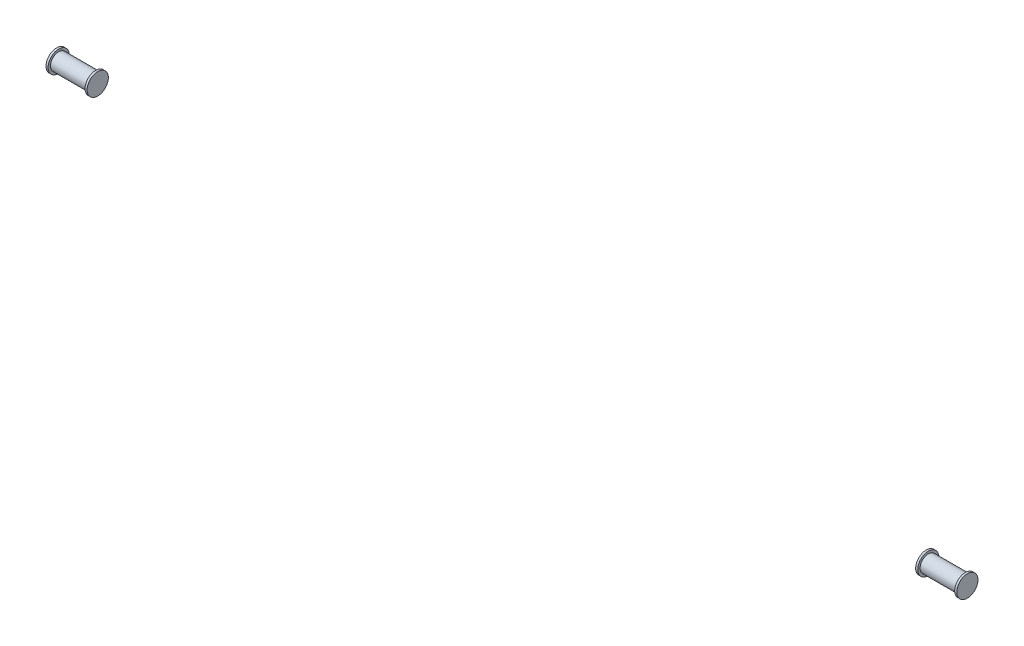
ISO-10303-21;
HEADER;
FILE_DESCRIPTION(('STEP AP214'),'2;1');
FILE_NAME('part.step','',(''),(''),'','','');
FILE_SCHEMA(('AUTOMOTIVE_DESIGN { 1 0 10303 214 1 1 1 1 }'));
ENDSEC;
DATA;
#1=APPLICATION_CONTEXT('core data for automotive mechanical design processes');
#2=APPLICATION_PROTOCOL_DEFINITION('international standard','automotive_design',2000,#1);
#3=PRODUCT_CONTEXT('',#1,'mechanical');
#4=PRODUCT('Part','Part','',(#3));
#5=PRODUCT_RELATED_PRODUCT_CATEGORY('part','',(#4));
#6=PRODUCT_DEFINITION_FORMATION('','',#4);
#7=PRODUCT_DEFINITION_CONTEXT('part definition',#1,'design');
#8=PRODUCT_DEFINITION('design','',#6,#7);
#9=PRODUCT_DEFINITION_SHAPE('','',#8);
#10=(LENGTH_UNIT() NAMED_UNIT(*) SI_UNIT(.MILLI.,.METRE.));
#11=(NAMED_UNIT(*) PLANE_ANGLE_UNIT() SI_UNIT($,.RADIAN.));
#12=(NAMED_UNIT(*) SI_UNIT($,.STERADIAN.) SOLID_ANGLE_UNIT());
#13=UNCERTAINTY_MEASURE_WITH_UNIT(LENGTH_MEASURE(1.E-05),#10,'distance_accuracy_value','');
#14=(GEOMETRIC_REPRESENTATION_CONTEXT(3) GLOBAL_UNCERTAINTY_ASSIGNED_CONTEXT((#13)) GLOBAL_UNIT_ASSIGNED_CONTEXT((#10,
#11,#12)) REPRESENTATION_CONTEXT('',''));
#15=CARTESIAN_POINT('',(0.,0.,0.));
#16=DIRECTION('',(0.,0.,1.));
#17=DIRECTION('',(1.,0.,0.));
#18=AXIS2_PLACEMENT_3D('',#15,#16,#17);
#19=CARTESIAN_POINT('',(-213.7,-202.5,85.));
#20=DIRECTION('',(1.,0.,0.));
#21=DIRECTION('',(0.,0.,-1.));
#22=AXIS2_PLACEMENT_3D('',#19,#20,#21);
#23=CYLINDRICAL_SURFACE('',#22,3.9);
#24=CARTESIAN_POINT('',(-196.3,-202.5,85.));
#25=DIRECTION('',(-1.,0.,0.));
#26=DIRECTION('',(0.,0.,1.));
#27=AXIS2_PLACEMENT_3D('',#24,#25,#26);
#28=CIRCLE('',#27,3.9);
#29=CARTESIAN_POINT('',(-196.3,-202.5,88.9));
#30=VERTEX_POINT('',#29);
#31=EDGE_CURVE('P0_E34',#30,#30,#28,.F.);
#32=ORIENTED_EDGE('',*,*,#31,.F.);
#33=EDGE_LOOP('',(#32));
#34=FACE_BOUND('',#33,.T.);
#35=CARTESIAN_POINT('',(-213.7,-202.5,85.));
#36=DIRECTION('',(1.,0.,0.));
#37=DIRECTION('',(0.,0.,-1.));
#38=AXIS2_PLACEMENT_3D('',#35,#36,#37);
#39=CIRCLE('',#38,3.9);
#40=CARTESIAN_POINT('',(-213.7,-202.5,81.1));
#41=VERTEX_POINT('',#40);
#42=EDGE_CURVE('P0_E10',#41,#41,#39,.F.);
#43=ORIENTED_EDGE('',*,*,#42,.F.);
#44=EDGE_LOOP('',(#43));
#45=FACE_BOUND('',#44,.T.);
#46=ADVANCED_FACE('P0_F15',(#34,#45),#23,.T.);
#47=CARTESIAN_POINT('',(-213.7,-202.5,85.));
#48=DIRECTION('',(1.,0.,0.));
#49=DIRECTION('',(0.,0.,-1.));
#50=AXIS2_PLACEMENT_3D('',#47,#48,#49);
#51=PLANE('',#50);
#52=ORIENTED_EDGE('',*,*,#42,.T.);
#53=EDGE_LOOP('',(#52));
#54=FACE_BOUND('',#53,.T.);
#55=CARTESIAN_POINT('',(-213.7,-202.5,85.));
#56=DIRECTION('',(-1.,0.,0.));
#57=DIRECTION('',(0.,0.,1.));
#58=AXIS2_PLACEMENT_3D('',#55,#56,#57);
#59=CIRCLE('',#58,5.);
#60=CARTESIAN_POINT('',(-213.7,-202.5,90.));
#61=VERTEX_POINT('',#60);
#62=EDGE_CURVE('P0_E22',#61,#61,#59,.T.);
#63=ORIENTED_EDGE('',*,*,#62,.F.);
#64=EDGE_LOOP('',(#63));
#65=FACE_BOUND('',#64,.T.);
#66=ADVANCED_FACE('P0_F65',(#54,#65),#51,.T.);
#67=CARTESIAN_POINT('',(-214.7,-202.5,85.));
#68=DIRECTION('',(-1.,0.,0.));
#69=DIRECTION('',(0.,0.,1.));
#70=AXIS2_PLACEMENT_3D('',#67,#68,#69);
#71=PLANE('',#70);
#72=CARTESIAN_POINT('',(-214.7,-202.5,85.));
#73=DIRECTION('',(1.,0.,0.));
#74=DIRECTION('',(0.,0.,-1.));
#75=AXIS2_PLACEMENT_3D('',#72,#73,#74);
#76=CIRCLE('',#75,5.);
#77=CARTESIAN_POINT('',(-214.7,-202.5,80.));
#78=VERTEX_POINT('',#77);
#79=EDGE_CURVE('P0_E29',#78,#78,#76,.T.);
#80=ORIENTED_EDGE('',*,*,#79,.F.);
#81=EDGE_LOOP('',(#80));
#82=FACE_BOUND('',#81,.T.);
#83=ADVANCED_FACE('P0_F69',(#82),#71,.T.);
#84=CARTESIAN_POINT('',(-214.7,-202.5,85.));
#85=DIRECTION('',(1.,0.,0.));
#86=DIRECTION('',(0.,0.,-1.));
#87=AXIS2_PLACEMENT_3D('',#84,#85,#86);
#88=CYLINDRICAL_SURFACE('',#87,5.);
#89=ORIENTED_EDGE('',*,*,#62,.T.);
#90=EDGE_LOOP('',(#89));
#91=FACE_BOUND('',#90,.T.);
#92=ORIENTED_EDGE('',*,*,#79,.T.);
#93=EDGE_LOOP('',(#92));
#94=FACE_BOUND('',#93,.T.);
#95=ADVANCED_FACE('P0_F61',(#91,#94),#88,.T.);
#96=CARTESIAN_POINT('',(-195.3,-202.5,85.));
#97=DIRECTION('',(1.,0.,0.));
#98=DIRECTION('',(0.,0.,-1.));
#99=AXIS2_PLACEMENT_3D('',#96,#97,#98);
#100=PLANE('',#99);
#101=CARTESIAN_POINT('',(-195.3,-202.5,85.));
#102=DIRECTION('',(-1.,0.,0.));
#103=DIRECTION('',(0.,0.,1.));
#104=AXIS2_PLACEMENT_3D('',#101,#102,#103);
#105=CIRCLE('',#104,5.);
#106=CARTESIAN_POINT('',(-195.3,-202.5,90.));
#107=VERTEX_POINT('',#106);
#108=EDGE_CURVE('P0_E39',#107,#107,#105,.T.);
#109=ORIENTED_EDGE('',*,*,#108,.F.);
#110=EDGE_LOOP('',(#109));
#111=FACE_BOUND('',#110,.T.);
#112=ADVANCED_FACE('P0_F52',(#111),#100,.T.);
#113=CARTESIAN_POINT('',(-196.3,-202.5,85.));
#114=DIRECTION('',(-1.,0.,0.));
#115=DIRECTION('',(0.,0.,1.));
#116=AXIS2_PLACEMENT_3D('',#113,#114,#115);
#117=PLANE('',#116);
#118=ORIENTED_EDGE('',*,*,#31,.T.);
#119=EDGE_LOOP('',(#118));
#120=FACE_BOUND('',#119,.T.);
#121=CARTESIAN_POINT('',(-196.3,-202.5,85.));
#122=DIRECTION('',(1.,0.,0.));
#123=DIRECTION('',(0.,0.,-1.));
#124=AXIS2_PLACEMENT_3D('',#121,#122,#123);
#125=CIRCLE('',#124,5.);
#126=CARTESIAN_POINT('',(-196.3,-202.5,80.));
#127=VERTEX_POINT('',#126);
#128=EDGE_CURVE('P0_E43',#127,#127,#125,.T.);
#129=ORIENTED_EDGE('',*,*,#128,.F.);
#130=EDGE_LOOP('',(#129));
#131=FACE_BOUND('',#130,.T.);
#132=ADVANCED_FACE('P0_F50',(#120,#131),#117,.T.);
#133=CARTESIAN_POINT('',(-196.3,-202.5,85.));
#134=DIRECTION('',(1.,0.,0.));
#135=DIRECTION('',(0.,0.,-1.));
#136=AXIS2_PLACEMENT_3D('',#133,#134,#135);
#137=CYLINDRICAL_SURFACE('',#136,5.);
#138=ORIENTED_EDGE('',*,*,#108,.T.);
#139=EDGE_LOOP('',(#138));
#140=FACE_BOUND('',#139,.T.);
#141=ORIENTED_EDGE('',*,*,#128,.T.);
#142=EDGE_LOOP('',(#141));
#143=FACE_BOUND('',#142,.T.);
#144=ADVANCED_FACE('P0_F48',(#140,#143),#137,.T.);
#145=CLOSED_SHELL('',(#46,#66,#83,#95,#112,#132,#144));
#146=MANIFOLD_SOLID_BREP('P0_B1',#145);
#147=CARTESIAN_POINT('',(196.3,-202.5,85.));
#148=DIRECTION('',(1.,0.,0.));
#149=DIRECTION('',(0.,0.,-1.));
#150=AXIS2_PLACEMENT_3D('',#147,#148,#149);
#151=CYLINDRICAL_SURFACE('',#150,3.9);
#152=CARTESIAN_POINT('',(213.7,-202.5,85.));
#153=DIRECTION('',(-1.,0.,0.));
#154=DIRECTION('',(0.,0.,1.));
#155=AXIS2_PLACEMENT_3D('',#152,#153,#154);
#156=CIRCLE('',#155,3.9);
#157=CARTESIAN_POINT('',(213.7,-202.5,88.9));
#158=VERTEX_POINT('',#157);
#159=EDGE_CURVE('P1_E35',#158,#158,#156,.F.);
#160=ORIENTED_EDGE('',*,*,#159,.F.);
#161=EDGE_LOOP('',(#160));
#162=FACE_BOUND('',#161,.T.);
#163=CARTESIAN_POINT('',(196.3,-202.5,85.));
#164=DIRECTION('',(1.,0.,0.));
#165=DIRECTION('',(0.,0.,-1.));
#166=AXIS2_PLACEMENT_3D('',#163,#164,#165);
#167=CIRCLE('',#166,3.9);
#168=CARTESIAN_POINT('',(196.3,-202.5,81.1));
#169=VERTEX_POINT('',#168);
#170=EDGE_CURVE('P1_E10',#169,#169,#167,.F.);
#171=ORIENTED_EDGE('',*,*,#170,.F.);
#172=EDGE_LOOP('',(#171));
#173=FACE_BOUND('',#172,.T.);
#174=ADVANCED_FACE('P1_F15',(#162,#173),#151,.T.);
#175=CARTESIAN_POINT('',(196.3,-202.5,85.));
#176=DIRECTION('',(1.,0.,0.));
#177=DIRECTION('',(0.,0.,-1.));
#178=AXIS2_PLACEMENT_3D('',#175,#176,#177);
#179=PLANE('',#178);
#180=ORIENTED_EDGE('',*,*,#170,.T.);
#181=EDGE_LOOP('',(#180));
#182=FACE_BOUND('',#181,.T.);
#183=CARTESIAN_POINT('',(196.3,-202.5,85.));
#184=DIRECTION('',(-1.,0.,0.));
#185=DIRECTION('',(0.,0.,1.));
#186=AXIS2_PLACEMENT_3D('',#183,#184,#185);
#187=CIRCLE('',#186,5.);
#188=CARTESIAN_POINT('',(196.3,-202.5,90.));
#189=VERTEX_POINT('',#188);
#190=EDGE_CURVE('P1_E22',#189,#189,#187,.T.);
#191=ORIENTED_EDGE('',*,*,#190,.F.);
#192=EDGE_LOOP('',(#191));
#193=FACE_BOUND('',#192,.T.);
#194=ADVANCED_FACE('P1_F65',(#182,#193),#179,.T.);
#195=CARTESIAN_POINT('',(195.3,-202.5,85.));
#196=DIRECTION('',(-1.,0.,0.));
#197=DIRECTION('',(0.,0.,1.));
#198=AXIS2_PLACEMENT_3D('',#195,#196,#197);
#199=PLANE('',#198);
#200=CARTESIAN_POINT('',(195.3,-202.5,85.));
#201=DIRECTION('',(1.,0.,0.));
#202=DIRECTION('',(0.,0.,-1.));
#203=AXIS2_PLACEMENT_3D('',#200,#201,#202);
#204=CIRCLE('',#203,5.);
#205=CARTESIAN_POINT('',(195.3,-202.5,80.));
#206=VERTEX_POINT('',#205);
#207=EDGE_CURVE('P1_E29',#206,#206,#204,.T.);
#208=ORIENTED_EDGE('',*,*,#207,.F.);
#209=EDGE_LOOP('',(#208));
#210=FACE_BOUND('',#209,.T.);
#211=ADVANCED_FACE('P1_F69',(#210),#199,.T.);
#212=CARTESIAN_POINT('',(195.3,-202.5,85.));
#213=DIRECTION('',(1.,0.,0.));
#214=DIRECTION('',(0.,0.,-1.));
#215=AXIS2_PLACEMENT_3D('',#212,#213,#214);
#216=CYLINDRICAL_SURFACE('',#215,5.);
#217=ORIENTED_EDGE('',*,*,#190,.T.);
#218=EDGE_LOOP('',(#217));
#219=FACE_BOUND('',#218,.T.);
#220=ORIENTED_EDGE('',*,*,#207,.T.);
#221=EDGE_LOOP('',(#220));
#222=FACE_BOUND('',#221,.T.);
#223=ADVANCED_FACE('P1_F61',(#219,#222),#216,.T.);
#224=CARTESIAN_POINT('',(214.7,-202.5,85.));
#225=DIRECTION('',(1.,0.,0.));
#226=DIRECTION('',(0.,0.,-1.));
#227=AXIS2_PLACEMENT_3D('',#224,#225,#226);
#228=PLANE('',#227);
#229=CARTESIAN_POINT('',(214.7,-202.5,85.));
#230=DIRECTION('',(-1.,0.,0.));
#231=DIRECTION('',(0.,0.,1.));
#232=AXIS2_PLACEMENT_3D('',#229,#230,#231);
#233=CIRCLE('',#232,5.);
#234=CARTESIAN_POINT('',(214.7,-202.5,90.));
#235=VERTEX_POINT('',#234);
#236=EDGE_CURVE('P1_E40',#235,#235,#233,.T.);
#237=ORIENTED_EDGE('',*,*,#236,.F.);
#238=EDGE_LOOP('',(#237));
#239=FACE_BOUND('',#238,.T.);
#240=ADVANCED_FACE('P1_F52',(#239),#228,.T.);
#241=CARTESIAN_POINT('',(213.7,-202.5,85.));
#242=DIRECTION('',(-1.,0.,0.));
#243=DIRECTION('',(0.,0.,1.));
#244=AXIS2_PLACEMENT_3D('',#241,#242,#243);
#245=PLANE('',#244);
#246=ORIENTED_EDGE('',*,*,#159,.T.);
#247=EDGE_LOOP('',(#246));
#248=FACE_BOUND('',#247,.T.);
#249=CARTESIAN_POINT('',(213.7,-202.5,85.));
#250=DIRECTION('',(1.,0.,0.));
#251=DIRECTION('',(0.,0.,-1.));
#252=AXIS2_PLACEMENT_3D('',#249,#250,#251);
#253=CIRCLE('',#252,5.);
#254=CARTESIAN_POINT('',(213.7,-202.5,80.));
#255=VERTEX_POINT('',#254);
#256=EDGE_CURVE('P1_E43',#255,#255,#253,.T.);
#257=ORIENTED_EDGE('',*,*,#256,.F.);
#258=EDGE_LOOP('',(#257));
#259=FACE_BOUND('',#258,.T.);
#260=ADVANCED_FACE('P1_F50',(#248,#259),#245,.T.);
#261=CARTESIAN_POINT('',(213.7,-202.5,85.));
#262=DIRECTION('',(1.,0.,0.));
#263=DIRECTION('',(0.,0.,-1.));
#264=AXIS2_PLACEMENT_3D('',#261,#262,#263);
#265=CYLINDRICAL_SURFACE('',#264,5.);
#266=ORIENTED_EDGE('',*,*,#236,.T.);
#267=EDGE_LOOP('',(#266));
#268=FACE_BOUND('',#267,.T.);
#269=ORIENTED_EDGE('',*,*,#256,.T.);
#270=EDGE_LOOP('',(#269));
#271=FACE_BOUND('',#270,.T.);
#272=ADVANCED_FACE('P1_F48',(#268,#271),#265,.T.);
#273=CLOSED_SHELL('',(#174,#194,#211,#223,#240,#260,#272));
#274=MANIFOLD_SOLID_BREP('P1_B1',#273);
#275=ADVANCED_BREP_SHAPE_REPRESENTATION('',(#18,#146,#274),#14);
#276=SHAPE_DEFINITION_REPRESENTATION(#9,#275);
ENDSEC;
END-ISO-10303-21;
